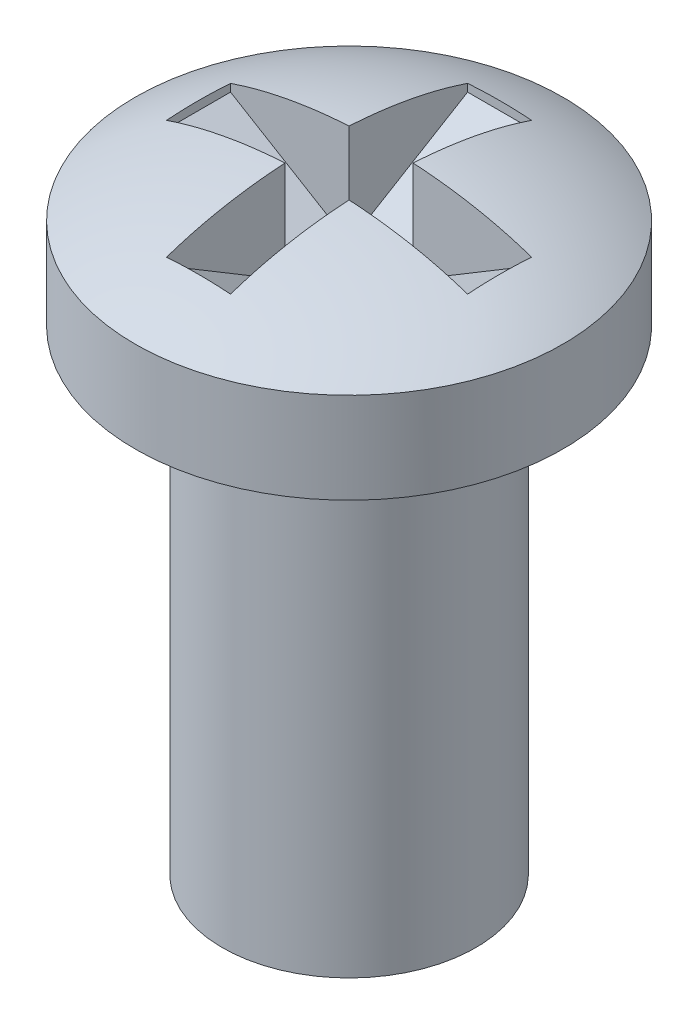
ISO-10303-21;
HEADER;
FILE_DESCRIPTION(('STEP AP214'),'2;1');
FILE_NAME('part.step','',(''),(''),'','','');
FILE_SCHEMA(('AUTOMOTIVE_DESIGN { 1 0 10303 214 1 1 1 1 }'));
ENDSEC;
DATA;
#1=APPLICATION_CONTEXT('core data for automotive mechanical design processes');
#2=APPLICATION_PROTOCOL_DEFINITION('international standard','automotive_design',2000,#1);
#3=PRODUCT_CONTEXT('',#1,'mechanical');
#4=PRODUCT('Part','Part','',(#3));
#5=PRODUCT_RELATED_PRODUCT_CATEGORY('part','',(#4));
#6=PRODUCT_DEFINITION_FORMATION('','',#4);
#7=PRODUCT_DEFINITION_CONTEXT('part definition',#1,'design');
#8=PRODUCT_DEFINITION('design','',#6,#7);
#9=PRODUCT_DEFINITION_SHAPE('','',#8);
#10=(LENGTH_UNIT() NAMED_UNIT(*) SI_UNIT(.MILLI.,.METRE.));
#11=(NAMED_UNIT(*) PLANE_ANGLE_UNIT() SI_UNIT($,.RADIAN.));
#12=(NAMED_UNIT(*) SI_UNIT($,.STERADIAN.) SOLID_ANGLE_UNIT());
#13=UNCERTAINTY_MEASURE_WITH_UNIT(LENGTH_MEASURE(1.E-05),#10,'distance_accuracy_value','');
#14=(GEOMETRIC_REPRESENTATION_CONTEXT(3) GLOBAL_UNCERTAINTY_ASSIGNED_CONTEXT((#13)) GLOBAL_UNIT_ASSIGNED_CONTEXT((#10,
#11,#12)) REPRESENTATION_CONTEXT('',''));
#15=CARTESIAN_POINT('',(0.,0.,0.));
#16=DIRECTION('',(0.,0.,1.));
#17=DIRECTION('',(1.,0.,0.));
#18=AXIS2_PLACEMENT_3D('',#15,#16,#17);
#19=CARTESIAN_POINT('',(0.,-0.2,0.202001949310081));
#20=DIRECTION('',(0.,0.,-1.));
#21=DIRECTION('',(-1.,0.,0.));
#22=AXIS2_PLACEMENT_3D('',#19,#20,#21);
#23=PLANE('',#22);
#24=DIRECTION('',(0.,-1.,0.));
#25=VECTOR('',#24,1.);
#26=CARTESIAN_POINT('',(-0.202001949310081,-0.2,0.202001949310082));
#27=LINE('',#26,#25);
#28=CARTESIAN_POINT('',(-0.202001949310081,-0.0116409944145338,0.202001949310082));
#29=VERTEX_POINT('',#28);
#30=CARTESIAN_POINT('',(-0.202001949310081,-0.649442571768954,0.202001949310082));
#31=VERTEX_POINT('',#30);
#32=EDGE_CURVE('E50',#29,#31,#27,.T.);
#33=ORIENTED_EDGE('',*,*,#32,.T.);
#34=DIRECTION('',(-0.857167300702112,0.515038074910054,0.));
#35=VECTOR('',#34,1.);
#36=CARTESIAN_POINT('',(-0.950000000000001,-0.2,0.202001949310081));
#37=LINE('',#36,#35);
#38=CARTESIAN_POINT('',(-0.950000000000001,-0.2,0.202001949310081));
#39=VERTEX_POINT('',#38);
#40=EDGE_CURVE('E128',#31,#39,#37,.T.);
#41=ORIENTED_EDGE('',*,*,#40,.T.);
#42=DIRECTION('',(0.,1.,0.));
#43=VECTOR('',#42,1.);
#44=CARTESIAN_POINT('',(-0.949999999999999,-0.2,0.202001949310084));
#45=LINE('',#44,#43);
#46=CARTESIAN_POINT('',(-0.949999999999999,-0.152171020069083,0.202001949310084));
#47=VERTEX_POINT('',#46);
#48=EDGE_CURVE('E201',#39,#47,#45,.T.);
#49=ORIENTED_EDGE('',*,*,#48,.T.);
#50=CARTESIAN_POINT('',(-0.949999999999999,-0.152171020069083,0.202001949310084));
#51=CARTESIAN_POINT('',(-0.875424344397262,-0.126727596025172,0.202001949310084));
#52=CARTESIAN_POINT('',(-0.799649331969492,-0.105016563048214,0.202001949310084));
#53=CARTESIAN_POINT('',(-0.646871079943858,-0.0685127803115854,0.202001949310083));
#54=CARTESIAN_POINT('',(-0.569876670968002,-0.0536833421681906,0.202001949310083));
#55=CARTESIAN_POINT('',(-0.444385225223556,-0.034602421050048,0.202001949310083));
#56=CARTESIAN_POINT('',(-0.396158293138948,-0.0284722555175424,0.202001949310083));
#57=CARTESIAN_POINT('',(-0.299309735390847,-0.0184188391481567,0.202001949310082));
#58=CARTESIAN_POINT('',(-0.250687327563442,-0.0145030873435489,0.202001949310082));
#59=CARTESIAN_POINT('',(-0.202001949310081,-0.0116409944145338,0.202001949310082));
#60=B_SPLINE_CURVE_WITH_KNOTS('',3,(#50,#51,#52,#53,#54,#55,#56,#57,#58,#59),.UNSPECIFIED.,.F.,
.F.,(4,2,2,2,4),(0.,0.236197192134715,0.471120235844108,0.616920567753226,0.763211735105379),.UNSPECIFIED.);
#61=EDGE_CURVE('E238',#47,#29,#60,.T.);
#62=ORIENTED_EDGE('',*,*,#61,.T.);
#63=EDGE_LOOP('',(#33,#41,#49,#62));
#64=FACE_BOUND('',#63,.T.);
#65=ADVANCED_FACE('F33',(#64),#23,.T.);
#66=CARTESIAN_POINT('',(0.,-0.2,-0.202001949310081));
#67=DIRECTION('',(0.,0.,1.));
#68=DIRECTION('',(1.,0.,0.));
#69=AXIS2_PLACEMENT_3D('',#66,#67,#68);
#70=PLANE('',#69);
#71=DIRECTION('',(0.857167300702112,-0.515038074910054,0.));
#72=VECTOR('',#71,1.);
#73=CARTESIAN_POINT('',(-0.949999999999995,-0.200000000000004,-0.202001949310077));
#74=LINE('',#73,#72);
#75=CARTESIAN_POINT('',(-0.950000000000001,-0.2,-0.202001949310077));
#76=VERTEX_POINT('',#75);
#77=CARTESIAN_POINT('',(-0.202001949310081,-0.649442571768954,-0.20200194931008));
#78=VERTEX_POINT('',#77);
#79=EDGE_CURVE('E126',#76,#78,#74,.T.);
#80=ORIENTED_EDGE('',*,*,#79,.T.);
#81=DIRECTION('',(0.,-1.,0.));
#82=VECTOR('',#81,1.);
#83=CARTESIAN_POINT('',(-0.202001949310081,-0.2,-0.20200194931008));
#84=LINE('',#83,#82);
#85=CARTESIAN_POINT('',(-0.202001949310081,-0.0116409944145356,-0.20200194931008));
#86=VERTEX_POINT('',#85);
#87=EDGE_CURVE('E137',#86,#78,#84,.T.);
#88=ORIENTED_EDGE('',*,*,#87,.F.);
#89=CARTESIAN_POINT('',(0.949999999999998,-0.152171020069083,-0.202001949310085));
#90=CARTESIAN_POINT('',(0.875562613311327,-0.126776554763624,-0.202001949310085));
#91=CARTESIAN_POINT('',(0.799941673213779,-0.105101007371732,-0.202001949310085));
#92=CARTESIAN_POINT('',(0.647177293195632,-0.0685714089569718,-0.202001949310084));
#93=CARTESIAN_POINT('',(0.570036297283043,-0.0537072126627006,-0.202001949310084));
#94=CARTESIAN_POINT('',(0.414977042048123,-0.0301313192279475,-0.202001949310083));
#95=CARTESIAN_POINT('',(0.337060267721452,-0.0214095553519167,-0.202001949310083));
#96=CARTESIAN_POINT('',(0.180735149840357,-0.00953063112849328,-0.202001949310082));
#97=CARTESIAN_POINT('',(0.102326387805852,-0.00637912464353206,-0.202001949310082));
#98=CARTESIAN_POINT('',(-0.0585072806257302,-0.00527521555590168,-0.202001949310081));
#99=CARTESIAN_POINT('',(-0.140934136395482,-0.00759467694382193,-0.202001949310081));
#100=CARTESIAN_POINT('',(-0.305387290289369,-0.0183063574876427,-0.20200194931008));
#101=CARTESIAN_POINT('',(-0.387413658566783,-0.0266974716182737,-0.20200194931008));
#102=CARTESIAN_POINT('',(-0.550571658743788,-0.050180552636103,-0.202001949310079));
#103=CARTESIAN_POINT('',(-0.631702886578557,-0.0652754281853084,-0.202001949310079));
#104=CARTESIAN_POINT('',(-0.792323405067848,-0.102930226585382,-0.202001949310078));
#105=CARTESIAN_POINT('',(-0.87181015054957,-0.125500917446105,-0.202001949310078));
#106=CARTESIAN_POINT('',(-0.950000000000001,-0.152171020069083,-0.202001949310078));
#107=B_SPLINE_CURVE_WITH_KNOTS('',3,(#89,#90,#91,#92,#93,#94,#95,#96,#97,#98,#99,#100,#101,#102,
#103,#104,#105,#106),.UNSPECIFIED.,.F.,.F.,(4,2,2,2,2,2,2,2,4),(0.,0.235736290976032,
0.471120310417273,0.706117659297484,0.941353395965122,1.1885227670823,1.43564716531706,
1.68287889205403,1.93046828621854),.UNSPECIFIED.);
#108=CARTESIAN_POINT('',(-0.950000000000001,-0.152171020069083,-0.202001949310077));
#109=VERTEX_POINT('',#108);
#110=EDGE_CURVE('E161',#86,#109,#107,.T.);
#111=ORIENTED_EDGE('',*,*,#110,.T.);
#112=DIRECTION('',(0.,1.,0.));
#113=VECTOR('',#112,1.);
#114=CARTESIAN_POINT('',(-0.950000000000001,-0.2,-0.202001949310077));
#115=LINE('',#114,#113);
#116=EDGE_CURVE('E140',#76,#109,#115,.T.);
#117=ORIENTED_EDGE('',*,*,#116,.F.);
#118=EDGE_LOOP('',(#80,#88,#111,#117));
#119=FACE_BOUND('',#118,.T.);
#120=ADVANCED_FACE('F135',(#119),#70,.T.);
#121=CARTESIAN_POINT('',(-0.950000000000001,-0.2,-2.18589527276704));
#122=DIRECTION('',(0.515038074910054,0.857167300702112,0.));
#123=DIRECTION('',(-0.857167300702112,0.515038074910054,0.));
#124=AXIS2_PLACEMENT_3D('',#121,#122,#123);
#125=PLANE('',#124);
#126=ORIENTED_EDGE('',*,*,#40,.F.);
#127=DIRECTION('',(0.,0.,-1.));
#128=VECTOR('',#127,1.);
#129=CARTESIAN_POINT('',(-0.20200194931008,-0.649442571768954,-2.18589527276704));
#130=LINE('',#129,#128);
#131=EDGE_CURVE('E11',#31,#78,#130,.T.);
#132=ORIENTED_EDGE('',*,*,#131,.T.);
#133=ORIENTED_EDGE('',*,*,#79,.F.);
#134=DIRECTION('',(0.,0.,-1.));
#135=VECTOR('',#134,1.);
#136=CARTESIAN_POINT('',(-0.950000000000001,-0.2,-0.202001949310077));
#137=LINE('',#136,#135);
#138=EDGE_CURVE('E198',#39,#76,#137,.T.);
#139=ORIENTED_EDGE('',*,*,#138,.F.);
#140=EDGE_LOOP('',(#126,#132,#133,#139));
#141=FACE_BOUND('',#140,.T.);
#142=ADVANCED_FACE('F124',(#141),#125,.T.);
#143=CARTESIAN_POINT('',(1.35,-0.326458657049954,0.));
#144=CARTESIAN_POINT('',(0.947298492008952,-0.0888666459284939,0.));
#145=CARTESIAN_POINT('',(0.46319195270935,0.,0.));
#146=CARTESIAN_POINT('',(0.,0.,0.));
#147=B_SPLINE_CURVE_WITH_KNOTS('',3,(#143,#144,#145,#146),.UNSPECIFIED.,.F.,.F.,(4,4),(0.,1.),.UNSPECIFIED.);
#148=CARTESIAN_POINT('',(0.,0.,0.));
#149=DIRECTION('',(0.,1.,0.));
#150=AXIS1_PLACEMENT('',#148,#149);
#151=SURFACE_OF_REVOLUTION('',#147,#150);
#152=CARTESIAN_POINT('',(0.,-0.326458657049954,0.));
#153=DIRECTION('',(0.,1.,0.));
#154=DIRECTION('',(-1.,0.,0.));
#155=AXIS2_PLACEMENT_3D('',#152,#153,#154);
#156=CIRCLE('',#155,1.35);
#157=CARTESIAN_POINT('',(-1.35,-0.326458657049954,0.));
#158=VERTEX_POINT('',#157);
#159=EDGE_CURVE('E306',#158,#158,#156,.T.);
#160=ORIENTED_EDGE('',*,*,#159,.T.);
#161=EDGE_LOOP('',(#160));
#162=FACE_BOUND('',#161,.T.);
#163=ORIENTED_EDGE('',*,*,#110,.F.);
#164=CARTESIAN_POINT('',(-0.202001949310081,-0.152171020069083,-0.95));
#165=CARTESIAN_POINT('',(-0.202001949310081,-0.126710006509349,-0.875378107744539));
#166=CARTESIAN_POINT('',(-0.202001949310081,-0.104991506490282,-0.799565649861563));
#167=CARTESIAN_POINT('',(-0.202001949310081,-0.0684990049865396,-0.646792301634711));
#168=CARTESIAN_POINT('',(-0.202001949310081,-0.0536811136685107,-0.569841973102474));
#169=CARTESIAN_POINT('',(-0.202001949310081,-0.0295654332701106,-0.411278968791085));
#170=CARTESIAN_POINT('',(-0.202001949310081,-0.0205712208121301,-0.3296215782476));
#171=CARTESIAN_POINT('',(-0.202001949310081,-0.0086714159755852,-0.165296852615802));
#172=CARTESIAN_POINT('',(-0.202001949310081,-0.00580774049922348,-0.0826264273564121));
#173=CARTESIAN_POINT('',(-0.20200194931008,-0.00575921192657585,0.));
#174=B_SPLINE_CURVE_WITH_KNOTS('',3,(#164,#165,#166,#167,#168,#169,#170,#171,#172,#173),
.UNSPECIFIED.,.F.,.F.,(4,2,2,2,4),(0.,0.23632227097482,0.471120215014735,0.7173394712787,
0.965236918983216),.UNSPECIFIED.);
#175=CARTESIAN_POINT('',(-0.202001949310081,-0.152171020069083,-0.95));
#176=VERTEX_POINT('',#175);
#177=EDGE_CURVE('E160',#176,#86,#174,.T.);
#178=ORIENTED_EDGE('',*,*,#177,.F.);
#179=CARTESIAN_POINT('',(0.202001949310081,-0.152171020069083,-0.95));
#180=CARTESIAN_POINT('',(0.13466796620672,-0.147304674385018,-0.95));
#181=CARTESIAN_POINT('',(0.0673339831033603,-0.144871501542985,-0.95));
#182=CARTESIAN_POINT('',(-0.0673339831033602,-0.144871501542986,-0.95));
#183=CARTESIAN_POINT('',(-0.13466796620672,-0.147304674385018,-0.95));
#184=CARTESIAN_POINT('',(-0.202001949310081,-0.152171020069083,-0.95));
#185=B_SPLINE_CURVE_WITH_KNOTS('',3,(#179,#180,#181,#182,#183,#184),.UNSPECIFIED.,.F.,.F.,(4,2,
4),(0.,0.202133793552155,0.40426758710431),.UNSPECIFIED.);
#186=CARTESIAN_POINT('',(0.202001949310081,-0.152171020069083,-0.95));
#187=VERTEX_POINT('',#186);
#188=EDGE_CURVE('E330',#187,#176,#185,.T.);
#189=ORIENTED_EDGE('',*,*,#188,.F.);
#190=CARTESIAN_POINT('',(0.202001949310081,-0.00575921192657588,0.));
#191=CARTESIAN_POINT('',(0.202001949310081,-0.00578612670404184,-0.0680239837667228));
#192=CARTESIAN_POINT('',(0.202001949310081,-0.00773517412389061,-0.136052725718251));
#193=CARTESIAN_POINT('',(0.202001949310081,-0.0157556595549117,-0.271491929632842));
#194=CARTESIAN_POINT('',(0.202001949310081,-0.0218046030467988,-0.338903741498613));
#195=CARTESIAN_POINT('',(0.202001949310081,-0.0413498649582776,-0.498092440719945));
#196=CARTESIAN_POINT('',(0.202001949310081,-0.0567742852257466,-0.589649938138518));
#197=CARTESIAN_POINT('',(0.202001949310081,-0.097061480299833,-0.771362161640744));
#198=CARTESIAN_POINT('',(0.202001949310081,-0.121994120764727,-0.861501233222844));
#199=CARTESIAN_POINT('',(0.202001949310081,-0.152171020069083,-0.95));
#200=B_SPLINE_CURVE_WITH_KNOTS('',3,(#190,#191,#192,#193,#194,#195,#196,#197,#198,#199),
.UNSPECIFIED.,.F.,.F.,(4,2,2,2,4),(0.,0.204045268956149,0.406979988240773,0.685046575253211,
0.96519701940345),.UNSPECIFIED.);
#201=CARTESIAN_POINT('',(0.202001949310081,-0.011640994414534,-0.202001949310082));
#202=VERTEX_POINT('',#201);
#203=EDGE_CURVE('E325',#202,#187,#200,.T.);
#204=ORIENTED_EDGE('',*,*,#203,.F.);
#205=CARTESIAN_POINT('',(0.949999999999998,-0.152171020069083,-0.202001949310091));
#206=VERTEX_POINT('',#205);
#207=EDGE_CURVE('E162',#206,#202,#107,.T.);
#208=ORIENTED_EDGE('',*,*,#207,.F.);
#209=CARTESIAN_POINT('',(0.950000000000002,-0.152171020069083,0.202001949310071));
#210=CARTESIAN_POINT('',(0.950000000000002,-0.147304674385018,0.13466796620671));
#211=CARTESIAN_POINT('',(0.950000000000001,-0.144871501542985,0.0673339831033503));
#212=CARTESIAN_POINT('',(0.949999999999999,-0.144871501542985,-0.0673339831033701));
#213=CARTESIAN_POINT('',(0.949999999999999,-0.147304674385018,-0.13466796620673));
#214=CARTESIAN_POINT('',(0.949999999999998,-0.152171020069083,-0.202001949310091));
#215=B_SPLINE_CURVE_WITH_KNOTS('',3,(#209,#210,#211,#212,#213,#214),.UNSPECIFIED.,.F.,.F.,(4,2,
4),(0.,0.202133793552155,0.40426758710431),.UNSPECIFIED.);
#216=CARTESIAN_POINT('',(0.950000000000002,-0.152171020069083,0.202001949310071));
#217=VERTEX_POINT('',#216);
#218=EDGE_CURVE('E348',#217,#206,#215,.T.);
#219=ORIENTED_EDGE('',*,*,#218,.F.);
#220=CARTESIAN_POINT('',(0.202001949310081,-0.0116409944145336,0.202001949310079));
#221=CARTESIAN_POINT('',(0.298489224292394,-0.0173407369928243,0.202001949310078));
#222=CARTESIAN_POINT('',(0.394921975209867,-0.027151093661734,0.202001949310077));
#223=CARTESIAN_POINT('',(0.585656345045905,-0.0560147075025495,0.202001949310075));
#224=CARTESIAN_POINT('',(0.679968345902579,-0.0750004382759704,0.202001949310074));
#225=CARTESIAN_POINT('',(0.802714371285701,-0.106881772005851,0.202001949310072));
#226=CARTESIAN_POINT('',(0.832366865714425,-0.115149566527851,0.202001949310072));
#227=CARTESIAN_POINT('',(0.891410616127561,-0.13280835277816,0.202001949310071));
#228=CARTESIAN_POINT('',(0.920801100003524,-0.142201923300362,0.202001949310071));
#229=CARTESIAN_POINT('',(0.950000000000002,-0.152171020069083,0.202001949310071));
#230=B_SPLINE_CURVE_WITH_KNOTS('',3,(#220,#221,#222,#223,#224,#225,#226,#227,#228,#229),
.UNSPECIFIED.,.F.,.F.,(4,2,2,2,4),(0.,0.290188474321296,0.578273091078854,0.670604884111923,
0.763152374575303),.UNSPECIFIED.);
#231=CARTESIAN_POINT('',(0.202001949310081,-0.0116409944145336,0.202001949310079));
#232=VERTEX_POINT('',#231);
#233=EDGE_CURVE('E353',#232,#217,#230,.T.);
#234=ORIENTED_EDGE('',*,*,#233,.F.);
#235=CARTESIAN_POINT('',(0.202001949310081,-0.152171020069083,0.95));
#236=CARTESIAN_POINT('',(0.202001949310081,-0.126727596025172,0.875424344397262));
#237=CARTESIAN_POINT('',(0.202001949310081,-0.105016563048214,0.799649331969493));
#238=CARTESIAN_POINT('',(0.202001949310081,-0.0685127803115854,0.646871079943858));
#239=CARTESIAN_POINT('',(0.202001949310081,-0.0536833421681904,0.569876670968003));
#240=CARTESIAN_POINT('',(0.202001949310081,-0.0346024210500478,0.444385225223556));
#241=CARTESIAN_POINT('',(0.202001949310081,-0.0284722555175422,0.396158293138948));
#242=CARTESIAN_POINT('',(0.202001949310081,-0.0184188391481564,0.299309735390846));
#243=CARTESIAN_POINT('',(0.202001949310081,-0.0145030873435487,0.250687327563441));
#244=CARTESIAN_POINT('',(0.202001949310081,-0.0116409944145336,0.202001949310079));
#245=B_SPLINE_CURVE_WITH_KNOTS('',3,(#235,#236,#237,#238,#239,#240,#241,#242,#243,#244),
.UNSPECIFIED.,.F.,.F.,(4,2,2,2,4),(0.,0.236197192134715,0.471120235844108,0.616920567753227,
0.763211735105381),.UNSPECIFIED.);
#246=CARTESIAN_POINT('',(0.202001949310081,-0.152171020069083,0.95));
#247=VERTEX_POINT('',#246);
#248=EDGE_CURVE('E357',#247,#232,#245,.T.);
#249=ORIENTED_EDGE('',*,*,#248,.F.);
#250=CARTESIAN_POINT('',(-0.202001949310081,-0.152171020069083,0.95));
#251=CARTESIAN_POINT('',(-0.13466796620672,-0.147304674385018,0.95));
#252=CARTESIAN_POINT('',(-0.0673339831033601,-0.144871501542986,0.95));
#253=CARTESIAN_POINT('',(0.0673339831033605,-0.144871501542986,0.95));
#254=CARTESIAN_POINT('',(0.134667966206721,-0.147304674385018,0.95));
#255=CARTESIAN_POINT('',(0.202001949310081,-0.152171020069083,0.95));
#256=B_SPLINE_CURVE_WITH_KNOTS('',3,(#250,#251,#252,#253,#254,#255),.UNSPECIFIED.,.F.,.F.,(4,2,
4),(0.,0.202133793552155,0.404267587104311),.UNSPECIFIED.);
#257=CARTESIAN_POINT('',(-0.202001949310081,-0.152171020069083,0.95));
#258=VERTEX_POINT('',#257);
#259=EDGE_CURVE('E249',#258,#247,#256,.T.);
#260=ORIENTED_EDGE('',*,*,#259,.F.);
#261=CARTESIAN_POINT('',(-0.202001949310081,-0.0116409944145338,0.202001949310082));
#262=CARTESIAN_POINT('',(-0.202001949310081,-0.0173407369928247,0.298489224292396));
#263=CARTESIAN_POINT('',(-0.202001949310081,-0.0271510936617347,0.39492197520987));
#264=CARTESIAN_POINT('',(-0.202001949310081,-0.0560147075025507,0.585656345045909));
#265=CARTESIAN_POINT('',(-0.202001949310081,-0.0750004382759719,0.679968345902583));
#266=CARTESIAN_POINT('',(-0.202001949310081,-0.106881772005853,0.802714371285705));
#267=CARTESIAN_POINT('',(-0.202001949310081,-0.115149566527852,0.832366865714428));
#268=CARTESIAN_POINT('',(-0.202001949310081,-0.132808352778161,0.891410616127561));
#269=CARTESIAN_POINT('',(-0.202001949310081,-0.142201923300363,0.920801100003523));
#270=CARTESIAN_POINT('',(-0.202001949310081,-0.152171020069083,0.95));
#271=B_SPLINE_CURVE_WITH_KNOTS('',3,(#261,#262,#263,#264,#265,#266,#267,#268,#269,#270),
.UNSPECIFIED.,.F.,.F.,(4,2,2,2,4),(0.,0.290188474321299,0.578273091078858,0.670604884111924,
0.7631523745753),.UNSPECIFIED.);
#272=EDGE_CURVE('E243',#29,#258,#271,.T.);
#273=ORIENTED_EDGE('',*,*,#272,.F.);
#274=ORIENTED_EDGE('',*,*,#61,.F.);
#275=CARTESIAN_POINT('',(-0.950000000000001,-0.152171020069083,-0.202001949310077));
#276=CARTESIAN_POINT('',(-0.95,-0.147304674385018,-0.134667966206717));
#277=CARTESIAN_POINT('',(-0.95,-0.144871501542986,-0.0673339831033569));
#278=CARTESIAN_POINT('',(-0.95,-0.144871501542986,0.0673339831033636));
#279=CARTESIAN_POINT('',(-0.95,-0.147304674385018,0.134667966206724));
#280=CARTESIAN_POINT('',(-0.95,-0.152171020069083,0.202001949310084));
#281=B_SPLINE_CURVE_WITH_KNOTS('',3,(#275,#276,#277,#278,#279,#280),.UNSPECIFIED.,.F.,.F.,(4,2,
4),(0.,0.202133793552155,0.40426758710431),.UNSPECIFIED.);
#282=EDGE_CURVE('E233',#109,#47,#281,.T.);
#283=ORIENTED_EDGE('',*,*,#282,.F.);
#284=EDGE_LOOP('',(#163,#178,#189,#204,#208,#219,#234,#249,#260,#273,#274,#283));
#285=FACE_BOUND('',#284,.T.);
#286=ADVANCED_FACE('F35',(#162,#285),#151,.T.);
#287=CARTESIAN_POINT('',(-0.202001949310081,-0.2,0.));
#288=DIRECTION('',(1.,0.,0.));
#289=DIRECTION('',(0.,0.,-1.));
#290=AXIS2_PLACEMENT_3D('',#287,#288,#289);
#291=PLANE('',#290);
#292=ORIENTED_EDGE('',*,*,#177,.T.);
#293=ORIENTED_EDGE('',*,*,#87,.T.);
#294=DIRECTION('',(0.,0.515038074910055,-0.857167300702112));
#295=VECTOR('',#294,1.);
#296=CARTESIAN_POINT('',(-0.202001949310081,-0.770817588076184,0.));
#297=LINE('',#296,#295);
#298=CARTESIAN_POINT('',(-0.202001949310081,-0.2,-0.95));
#299=VERTEX_POINT('',#298);
#300=EDGE_CURVE('E146',#78,#299,#297,.T.);
#301=ORIENTED_EDGE('',*,*,#300,.T.);
#302=DIRECTION('',(0.,1.,0.));
#303=VECTOR('',#302,1.);
#304=CARTESIAN_POINT('',(-0.202001949310081,-0.2,-0.95));
#305=LINE('',#304,#303);
#306=EDGE_CURVE('E303',#299,#176,#305,.T.);
#307=ORIENTED_EDGE('',*,*,#306,.T.);
#308=EDGE_LOOP('',(#292,#293,#301,#307));
#309=FACE_BOUND('',#308,.T.);
#310=ADVANCED_FACE('F158',(#309),#291,.T.);
#311=CARTESIAN_POINT('',(0.202001949310081,-0.2,0.));
#312=DIRECTION('',(-1.,0.,0.));
#313=DIRECTION('',(0.,0.,1.));
#314=AXIS2_PLACEMENT_3D('',#311,#312,#313);
#315=PLANE('',#314);
#316=DIRECTION('',(0.,1.,0.));
#317=VECTOR('',#316,1.);
#318=CARTESIAN_POINT('',(0.202001949310081,-0.2,-0.95));
#319=LINE('',#318,#317);
#320=CARTESIAN_POINT('',(0.202001949310081,-0.2,-0.95));
#321=VERTEX_POINT('',#320);
#322=EDGE_CURVE('E301',#321,#187,#319,.T.);
#323=ORIENTED_EDGE('',*,*,#322,.F.);
#324=DIRECTION('',(0.,-0.515038074910055,0.857167300702112));
#325=VECTOR('',#324,1.);
#326=CARTESIAN_POINT('',(0.202001949310081,-0.770817588076184,0.));
#327=LINE('',#326,#325);
#328=CARTESIAN_POINT('',(0.202001949310081,-0.649442571768954,-0.20200194931008));
#329=VERTEX_POINT('',#328);
#330=EDGE_CURVE('E294',#321,#329,#327,.T.);
#331=ORIENTED_EDGE('',*,*,#330,.T.);
#332=DIRECTION('',(0.,1.,0.));
#333=VECTOR('',#332,1.);
#334=CARTESIAN_POINT('',(0.202001949310081,-0.2,-0.202001949310082));
#335=LINE('',#334,#333);
#336=EDGE_CURVE('E204',#329,#202,#335,.T.);
#337=ORIENTED_EDGE('',*,*,#336,.T.);
#338=ORIENTED_EDGE('',*,*,#203,.T.);
#339=EDGE_LOOP('',(#323,#331,#337,#338));
#340=FACE_BOUND('',#339,.T.);
#341=ADVANCED_FACE('F298',(#340),#315,.T.);
#342=CARTESIAN_POINT('',(0.8,-3.9,0.));
#343=DIRECTION('',(0.,1.,0.));
#344=DIRECTION('',(-1.,0.,0.));
#345=AXIS2_PLACEMENT_3D('',#342,#343,#344);
#346=PLANE('',#345);
#347=CARTESIAN_POINT('',(0.,-3.9,0.));
#348=DIRECTION('',(0.,1.,0.));
#349=DIRECTION('',(-1.,0.,0.));
#350=AXIS2_PLACEMENT_3D('',#347,#348,#349);
#351=CIRCLE('',#350,0.8);
#352=CARTESIAN_POINT('',(-0.8,-3.9,0.));
#353=VERTEX_POINT('',#352);
#354=EDGE_CURVE('E322',#353,#353,#351,.T.);
#355=ORIENTED_EDGE('',*,*,#354,.F.);
#356=EDGE_LOOP('',(#355));
#357=FACE_BOUND('',#356,.T.);
#358=ADVANCED_FACE('F337',(#357),#346,.F.);
#359=CARTESIAN_POINT('',(0.,0.,0.));
#360=DIRECTION('',(0.,1.,0.));
#361=DIRECTION('',(-1.,0.,0.));
#362=AXIS2_PLACEMENT_3D('',#359,#360,#361);
#363=CYLINDRICAL_SURFACE('',#362,0.8);
#364=CARTESIAN_POINT('',(0.,-0.9,0.));
#365=DIRECTION('',(0.,1.,0.));
#366=DIRECTION('',(-1.,0.,0.));
#367=AXIS2_PLACEMENT_3D('',#364,#365,#366);
#368=CIRCLE('',#367,0.8);
#369=CARTESIAN_POINT('',(-0.8,-0.9,0.));
#370=VERTEX_POINT('',#369);
#371=EDGE_CURVE('E319',#370,#370,#368,.T.);
#372=ORIENTED_EDGE('',*,*,#371,.F.);
#373=EDGE_LOOP('',(#372));
#374=FACE_BOUND('',#373,.T.);
#375=ORIENTED_EDGE('',*,*,#354,.T.);
#376=EDGE_LOOP('',(#375));
#377=FACE_BOUND('',#376,.T.);
#378=ADVANCED_FACE('F510',(#374,#377),#363,.T.);
#379=CARTESIAN_POINT('',(1.35,-0.9,0.));
#380=DIRECTION('',(0.,1.,0.));
#381=DIRECTION('',(-1.,0.,0.));
#382=AXIS2_PLACEMENT_3D('',#379,#380,#381);
#383=PLANE('',#382);
#384=CARTESIAN_POINT('',(0.,-0.9,0.));
#385=DIRECTION('',(0.,1.,0.));
#386=DIRECTION('',(-1.,0.,0.));
#387=AXIS2_PLACEMENT_3D('',#384,#385,#386);
#388=CIRCLE('',#387,1.35);
#389=CARTESIAN_POINT('',(-1.35,-0.9,0.));
#390=VERTEX_POINT('',#389);
#391=EDGE_CURVE('E316',#390,#390,#388,.T.);
#392=ORIENTED_EDGE('',*,*,#391,.F.);
#393=EDGE_LOOP('',(#392));
#394=FACE_BOUND('',#393,.T.);
#395=ORIENTED_EDGE('',*,*,#371,.T.);
#396=EDGE_LOOP('',(#395));
#397=FACE_BOUND('',#396,.T.);
#398=ADVANCED_FACE('F501',(#394,#397),#383,.F.);
#399=CARTESIAN_POINT('',(0.,0.,0.));
#400=DIRECTION('',(0.,1.,0.));
#401=DIRECTION('',(-1.,0.,0.));
#402=AXIS2_PLACEMENT_3D('',#399,#400,#401);
#403=CYLINDRICAL_SURFACE('',#402,1.35);
#404=ORIENTED_EDGE('',*,*,#159,.F.);
#405=EDGE_LOOP('',(#404));
#406=FACE_BOUND('',#405,.T.);
#407=ORIENTED_EDGE('',*,*,#391,.T.);
#408=EDGE_LOOP('',(#407));
#409=FACE_BOUND('',#408,.T.);
#410=ADVANCED_FACE('F279',(#406,#409),#403,.T.);
#411=CARTESIAN_POINT('',(0.202001949310081,-0.2,-0.95));
#412=DIRECTION('',(0.,0.,1.));
#413=DIRECTION('',(1.,0.,0.));
#414=AXIS2_PLACEMENT_3D('',#411,#412,#413);
#415=PLANE('',#414);
#416=ORIENTED_EDGE('',*,*,#188,.T.);
#417=ORIENTED_EDGE('',*,*,#306,.F.);
#418=DIRECTION('',(1.,0.,0.));
#419=VECTOR('',#418,1.);
#420=CARTESIAN_POINT('',(0.202001949310081,-0.2,-0.95));
#421=LINE('',#420,#419);
#422=EDGE_CURVE('E151',#299,#321,#421,.T.);
#423=ORIENTED_EDGE('',*,*,#422,.T.);
#424=ORIENTED_EDGE('',*,*,#322,.T.);
#425=EDGE_LOOP('',(#416,#417,#423,#424));
#426=FACE_BOUND('',#425,.T.);
#427=ADVANCED_FACE('F274',(#426),#415,.T.);
#428=DIRECTION('',(-0.857167300702111,-0.515038074910056,0.));
#429=VECTOR('',#428,1.);
#430=CARTESIAN_POINT('',(0.,-0.770817588076184,0.202001949310081));
#431=LINE('',#430,#429);
#432=CARTESIAN_POINT('',(0.949999999999998,-0.2,0.202001949310081));
#433=VERTEX_POINT('',#432);
#434=CARTESIAN_POINT('',(0.202001949310079,-0.649442571768955,0.202001949310081));
#435=VERTEX_POINT('',#434);
#436=EDGE_CURVE('E169',#433,#435,#431,.T.);
#437=ORIENTED_EDGE('',*,*,#436,.T.);
#438=DIRECTION('',(0.,-1.,0.));
#439=VECTOR('',#438,1.);
#440=CARTESIAN_POINT('',(0.202001949310081,-0.2,0.202001949310079));
#441=LINE('',#440,#439);
#442=EDGE_CURVE('E58',#232,#435,#441,.T.);
#443=ORIENTED_EDGE('',*,*,#442,.F.);
#444=ORIENTED_EDGE('',*,*,#233,.T.);
#445=DIRECTION('',(0.,1.,0.));
#446=VECTOR('',#445,1.);
#447=CARTESIAN_POINT('',(0.950000000000002,-0.2,0.202001949310071));
#448=LINE('',#447,#446);
#449=EDGE_CURVE('E181',#433,#217,#448,.T.);
#450=ORIENTED_EDGE('',*,*,#449,.F.);
#451=EDGE_LOOP('',(#437,#443,#444,#450));
#452=FACE_BOUND('',#451,.T.);
#453=ADVANCED_FACE('F228',(#452),#23,.T.);
#454=CARTESIAN_POINT('',(-0.950000000000001,-0.2,-0.202001949310077));
#455=DIRECTION('',(1.,0.,0.));
#456=DIRECTION('',(0.,0.,-1.));
#457=AXIS2_PLACEMENT_3D('',#454,#455,#456);
#458=PLANE('',#457);
#459=ORIENTED_EDGE('',*,*,#282,.T.);
#460=ORIENTED_EDGE('',*,*,#48,.F.);
#461=ORIENTED_EDGE('',*,*,#138,.T.);
#462=ORIENTED_EDGE('',*,*,#116,.T.);
#463=EDGE_LOOP('',(#459,#460,#461,#462));
#464=FACE_BOUND('',#463,.T.);
#465=ADVANCED_FACE('F223',(#464),#458,.T.);
#466=CARTESIAN_POINT('',(-0.202001949310081,-0.2,0.));
#467=DIRECTION('',(1.,0.,0.));
#468=DIRECTION('',(0.,0.,-1.));
#469=AXIS2_PLACEMENT_3D('',#466,#467,#468);
#470=PLANE('',#469);
#471=ORIENTED_EDGE('',*,*,#272,.T.);
#472=DIRECTION('',(0.,1.,0.));
#473=VECTOR('',#472,1.);
#474=CARTESIAN_POINT('',(-0.202001949310081,-0.2,0.95));
#475=LINE('',#474,#473);
#476=CARTESIAN_POINT('',(-0.202001949310082,-0.2,0.950000000000001));
#477=VERTEX_POINT('',#476);
#478=EDGE_CURVE('E191',#477,#258,#475,.T.);
#479=ORIENTED_EDGE('',*,*,#478,.F.);
#480=DIRECTION('',(0.,-0.515038074910055,-0.857167300702112));
#481=VECTOR('',#480,1.);
#482=CARTESIAN_POINT('',(-0.202001949310082,-0.199999999999999,0.950000000000001));
#483=LINE('',#482,#481);
#484=EDGE_CURVE('E155',#477,#31,#483,.T.);
#485=ORIENTED_EDGE('',*,*,#484,.T.);
#486=ORIENTED_EDGE('',*,*,#32,.F.);
#487=EDGE_LOOP('',(#471,#479,#485,#486));
#488=FACE_BOUND('',#487,.T.);
#489=ADVANCED_FACE('F227',(#488),#470,.T.);
#490=CARTESIAN_POINT('',(0.202001949310081,-0.2,0.));
#491=DIRECTION('',(-1.,0.,0.));
#492=DIRECTION('',(0.,0.,1.));
#493=AXIS2_PLACEMENT_3D('',#490,#491,#492);
#494=PLANE('',#493);
#495=ORIENTED_EDGE('',*,*,#248,.T.);
#496=ORIENTED_EDGE('',*,*,#442,.T.);
#497=DIRECTION('',(0.,0.515038074910055,0.857167300702112));
#498=VECTOR('',#497,1.);
#499=CARTESIAN_POINT('',(0.202001949310082,-0.2,0.95));
#500=LINE('',#499,#498);
#501=CARTESIAN_POINT('',(0.202001949310082,-0.2,0.95));
#502=VERTEX_POINT('',#501);
#503=EDGE_CURVE('E291',#435,#502,#500,.T.);
#504=ORIENTED_EDGE('',*,*,#503,.T.);
#505=DIRECTION('',(0.,1.,0.));
#506=VECTOR('',#505,1.);
#507=CARTESIAN_POINT('',(0.202001949310081,-0.2,0.95));
#508=LINE('',#507,#506);
#509=EDGE_CURVE('E194',#502,#247,#508,.T.);
#510=ORIENTED_EDGE('',*,*,#509,.T.);
#511=EDGE_LOOP('',(#495,#496,#504,#510));
#512=FACE_BOUND('',#511,.T.);
#513=ADVANCED_FACE('F220',(#512),#494,.T.);
#514=CARTESIAN_POINT('',(-0.202001949310081,-0.2,0.95));
#515=DIRECTION('',(0.,0.,-1.));
#516=DIRECTION('',(-1.,0.,0.));
#517=AXIS2_PLACEMENT_3D('',#514,#515,#516);
#518=PLANE('',#517);
#519=ORIENTED_EDGE('',*,*,#259,.T.);
#520=ORIENTED_EDGE('',*,*,#509,.F.);
#521=DIRECTION('',(-1.,0.,0.));
#522=VECTOR('',#521,1.);
#523=CARTESIAN_POINT('',(-0.202001949310081,-0.2,0.95));
#524=LINE('',#523,#522);
#525=EDGE_CURVE('E188',#502,#477,#524,.T.);
#526=ORIENTED_EDGE('',*,*,#525,.T.);
#527=ORIENTED_EDGE('',*,*,#478,.T.);
#528=EDGE_LOOP('',(#519,#520,#526,#527));
#529=FACE_BOUND('',#528,.T.);
#530=ADVANCED_FACE('F260',(#529),#518,.T.);
#531=CARTESIAN_POINT('',(0.950000000000002,-0.2,0.202001949310071));
#532=DIRECTION('',(-1.,0.,0.));
#533=DIRECTION('',(0.,0.,1.));
#534=AXIS2_PLACEMENT_3D('',#531,#532,#533);
#535=PLANE('',#534);
#536=ORIENTED_EDGE('',*,*,#218,.T.);
#537=DIRECTION('',(0.,1.,0.));
#538=VECTOR('',#537,1.);
#539=CARTESIAN_POINT('',(0.949999999999998,-0.2,-0.202001949310091));
#540=LINE('',#539,#538);
#541=CARTESIAN_POINT('',(0.949999999999998,-0.2,-0.202001949310091));
#542=VERTEX_POINT('',#541);
#543=EDGE_CURVE('E184',#542,#206,#540,.T.);
#544=ORIENTED_EDGE('',*,*,#543,.F.);
#545=DIRECTION('',(0.,0.,1.));
#546=VECTOR('',#545,1.);
#547=CARTESIAN_POINT('',(0.950000000000002,-0.2,0.202001949310071));
#548=LINE('',#547,#546);
#549=EDGE_CURVE('E175',#542,#433,#548,.T.);
#550=ORIENTED_EDGE('',*,*,#549,.T.);
#551=ORIENTED_EDGE('',*,*,#449,.T.);
#552=EDGE_LOOP('',(#536,#544,#550,#551));
#553=FACE_BOUND('',#552,.T.);
#554=ADVANCED_FACE('F218',(#553),#535,.T.);
#555=ORIENTED_EDGE('',*,*,#336,.F.);
#556=DIRECTION('',(0.857167300702111,0.515038074910056,0.));
#557=VECTOR('',#556,1.);
#558=CARTESIAN_POINT('',(0.,-0.77081758807618,-0.202001949310081));
#559=LINE('',#558,#557);
#560=EDGE_CURVE('E141',#329,#542,#559,.T.);
#561=ORIENTED_EDGE('',*,*,#560,.T.);
#562=ORIENTED_EDGE('',*,*,#543,.T.);
#563=ORIENTED_EDGE('',*,*,#207,.T.);
#564=EDGE_LOOP('',(#555,#561,#562,#563));
#565=FACE_BOUND('',#564,.T.);
#566=ADVANCED_FACE('F212',(#565),#70,.T.);
#567=CARTESIAN_POINT('',(0.,-0.770817588076184,-2.18589527276704));
#568=DIRECTION('',(-0.515038074910056,0.857167300702111,0.));
#569=DIRECTION('',(-0.857167300702111,-0.515038074910056,0.));
#570=AXIS2_PLACEMENT_3D('',#567,#568,#569);
#571=PLANE('',#570);
#572=DIRECTION('',(0.,0.,-1.));
#573=VECTOR('',#572,1.);
#574=CARTESIAN_POINT('',(0.20200194931008,-0.649442571768954,-2.18589527276704));
#575=LINE('',#574,#573);
#576=EDGE_CURVE('E43',#435,#329,#575,.T.);
#577=ORIENTED_EDGE('',*,*,#576,.F.);
#578=ORIENTED_EDGE('',*,*,#436,.F.);
#579=ORIENTED_EDGE('',*,*,#549,.F.);
#580=ORIENTED_EDGE('',*,*,#560,.F.);
#581=EDGE_LOOP('',(#577,#578,#579,#580));
#582=FACE_BOUND('',#581,.T.);
#583=ADVANCED_FACE('F217',(#582),#571,.T.);
#584=CARTESIAN_POINT('',(-2.18589527276704,-0.770817588076184,0.));
#585=DIRECTION('',(0.,0.857167300702112,0.515038074910055));
#586=DIRECTION('',(0.,-0.515038074910055,0.857167300702112));
#587=AXIS2_PLACEMENT_3D('',#584,#585,#586);
#588=PLANE('',#587);
#589=ORIENTED_EDGE('',*,*,#330,.F.);
#590=ORIENTED_EDGE('',*,*,#422,.F.);
#591=ORIENTED_EDGE('',*,*,#300,.F.);
#592=DIRECTION('',(-1.,0.,0.));
#593=VECTOR('',#592,1.);
#594=CARTESIAN_POINT('',(0.,-0.649442571768954,-0.202001949310081));
#595=LINE('',#594,#593);
#596=EDGE_CURVE('E148',#329,#78,#595,.T.);
#597=ORIENTED_EDGE('',*,*,#596,.F.);
#598=EDGE_LOOP('',(#589,#590,#591,#597));
#599=FACE_BOUND('',#598,.T.);
#600=ADVANCED_FACE('F147',(#599),#588,.T.);
#601=CARTESIAN_POINT('',(-2.18589527276704,-0.2,0.950000000000001));
#602=DIRECTION('',(0.,0.857167300702112,-0.515038074910055));
#603=DIRECTION('',(0.,0.515038074910055,0.857167300702112));
#604=AXIS2_PLACEMENT_3D('',#601,#602,#603);
#605=PLANE('',#604);
#606=ORIENTED_EDGE('',*,*,#484,.F.);
#607=ORIENTED_EDGE('',*,*,#525,.F.);
#608=ORIENTED_EDGE('',*,*,#503,.F.);
#609=DIRECTION('',(1.,0.,0.));
#610=VECTOR('',#609,1.);
#611=CARTESIAN_POINT('',(0.,-0.649442571768954,0.202001949310081));
#612=LINE('',#611,#610);
#613=EDGE_CURVE('E167',#31,#435,#612,.T.);
#614=ORIENTED_EDGE('',*,*,#613,.F.);
#615=EDGE_LOOP('',(#606,#607,#608,#614));
#616=FACE_BOUND('',#615,.T.);
#617=ADVANCED_FACE('F289',(#616),#605,.T.);
#618=CARTESIAN_POINT('',(0.,-0.649442571768954,0.));
#619=DIRECTION('',(0.,1.,0.));
#620=DIRECTION('',(-1.,0.,0.));
#621=AXIS2_PLACEMENT_3D('',#618,#619,#620);
#622=PLANE('',#621);
#623=ORIENTED_EDGE('',*,*,#131,.F.);
#624=ORIENTED_EDGE('',*,*,#613,.T.);
#625=ORIENTED_EDGE('',*,*,#576,.T.);
#626=ORIENTED_EDGE('',*,*,#596,.T.);
#627=EDGE_LOOP('',(#623,#624,#625,#626));
#628=FACE_BOUND('',#627,.T.);
#629=ADVANCED_FACE('F165',(#628),#622,.T.);
#630=CLOSED_SHELL('',(#65,#120,#142,#286,#310,#341,#358,#378,#398,#410,#427,#453,#465,#489,#513,
#530,#554,#566,#583,#600,#617,#629));
#631=MANIFOLD_SOLID_BREP('B2',#630);
#632=ADVANCED_BREP_SHAPE_REPRESENTATION('',(#18,#631),#14);
#633=SHAPE_DEFINITION_REPRESENTATION(#9,#632);
ENDSEC;
END-ISO-10303-21;
